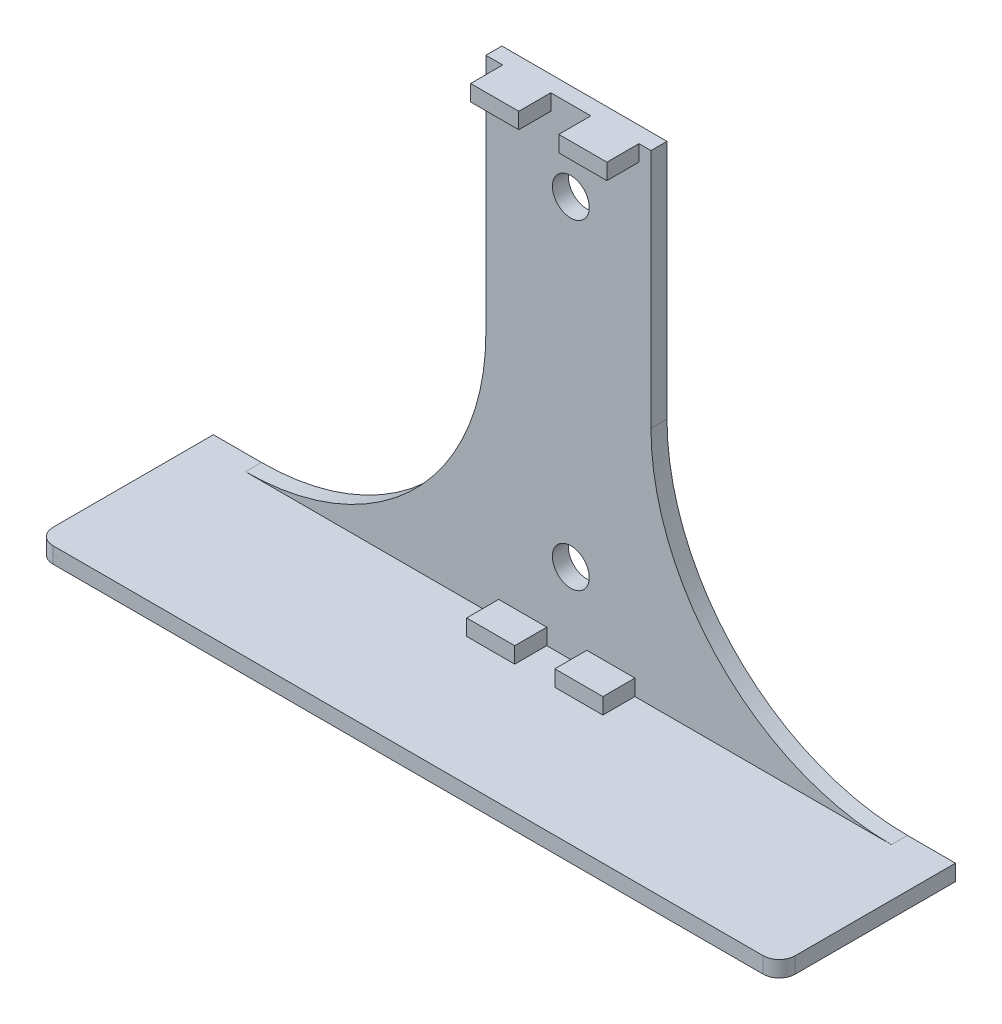
ISO-10303-21;
HEADER;
FILE_DESCRIPTION(('STEP AP214'),'2;1');
FILE_NAME('part.step','',(''),(''),'','','');
FILE_SCHEMA(('AUTOMOTIVE_DESIGN { 1 0 10303 214 1 1 1 1 }'));
ENDSEC;
DATA;
#1=APPLICATION_CONTEXT('core data for automotive mechanical design processes');
#2=APPLICATION_PROTOCOL_DEFINITION('international standard','automotive_design',2000,#1);
#3=PRODUCT_CONTEXT('',#1,'mechanical');
#4=PRODUCT('Part','Part','',(#3));
#5=PRODUCT_RELATED_PRODUCT_CATEGORY('part','',(#4));
#6=PRODUCT_DEFINITION_FORMATION('','',#4);
#7=PRODUCT_DEFINITION_CONTEXT('part definition',#1,'design');
#8=PRODUCT_DEFINITION('design','',#6,#7);
#9=PRODUCT_DEFINITION_SHAPE('','',#8);
#10=(LENGTH_UNIT() NAMED_UNIT(*) SI_UNIT(.MILLI.,.METRE.));
#11=(NAMED_UNIT(*) PLANE_ANGLE_UNIT() SI_UNIT($,.RADIAN.));
#12=(NAMED_UNIT(*) SI_UNIT($,.STERADIAN.) SOLID_ANGLE_UNIT());
#13=UNCERTAINTY_MEASURE_WITH_UNIT(LENGTH_MEASURE(1.E-05),#10,'distance_accuracy_value','');
#14=(GEOMETRIC_REPRESENTATION_CONTEXT(3) GLOBAL_UNCERTAINTY_ASSIGNED_CONTEXT((#13)) GLOBAL_UNIT_ASSIGNED_CONTEXT((#10,
#11,#12)) REPRESENTATION_CONTEXT('',''));
#15=CARTESIAN_POINT('',(0.,0.,0.));
#16=DIRECTION('',(0.,0.,1.));
#17=DIRECTION('',(1.,0.,0.));
#18=AXIS2_PLACEMENT_3D('',#15,#16,#17);
#19=CARTESIAN_POINT('',(0.,2.,0.));
#20=DIRECTION('',(0.,1.,0.));
#21=DIRECTION('',(0.,0.,1.));
#22=AXIS2_PLACEMENT_3D('',#19,#20,#21);
#23=PLANE('',#22);
#24=DIRECTION('',(-1.,0.,0.));
#25=VECTOR('',#24,1.);
#26=CARTESIAN_POINT('',(-192.646488806007,2.,-84.5666189891139));
#27=LINE('',#26,#25);
#28=CARTESIAN_POINT('',(-100.046488806007,2.,-84.5666189891139));
#29=VERTEX_POINT('',#28);
#30=CARTESIAN_POINT('',(-106.046488806007,2.,-84.5666189891139));
#31=VERTEX_POINT('',#30);
#32=EDGE_CURVE('E443',#29,#31,#27,.T.);
#33=ORIENTED_EDGE('',*,*,#32,.T.);
#34=DIRECTION('',(0.,0.,-1.));
#35=VECTOR('',#34,1.);
#36=CARTESIAN_POINT('',(-106.046488806007,2.,0.));
#37=LINE('',#36,#35);
#38=CARTESIAN_POINT('',(-106.046488806007,2.,-82.5666189891139));
#39=VERTEX_POINT('',#38);
#40=EDGE_CURVE('E508',#31,#39,#37,.F.);
#41=ORIENTED_EDGE('',*,*,#40,.T.);
#42=DIRECTION('',(1.,0.,0.));
#43=VECTOR('',#42,1.);
#44=CARTESIAN_POINT('',(-156.646488806007,2.,-82.5666189891139));
#45=LINE('',#44,#43);
#46=CARTESIAN_POINT('',(-138.046488806007,2.,-82.5666189891139));
#47=VERTEX_POINT('',#46);
#48=EDGE_CURVE('E401',#47,#39,#45,.T.);
#49=ORIENTED_EDGE('',*,*,#48,.F.);
#50=DIRECTION('',(0.,0.,-1.));
#51=VECTOR('',#50,1.);
#52=CARTESIAN_POINT('',(-138.046488806007,2.,-78.5666189891139));
#53=LINE('',#52,#51);
#54=CARTESIAN_POINT('',(-138.046488806007,2.,-78.5666189891139));
#55=VERTEX_POINT('',#54);
#56=EDGE_CURVE('E273',#55,#47,#53,.T.);
#57=ORIENTED_EDGE('',*,*,#56,.F.);
#58=DIRECTION('',(1.,0.,0.));
#59=VECTOR('',#58,1.);
#60=CARTESIAN_POINT('',(-144.046488806007,2.,-78.5666189891139));
#61=LINE('',#60,#59);
#62=CARTESIAN_POINT('',(-144.046488806007,2.,-78.5666189891139));
#63=VERTEX_POINT('',#62);
#64=EDGE_CURVE('E281',#63,#55,#61,.T.);
#65=ORIENTED_EDGE('',*,*,#64,.F.);
#66=DIRECTION('',(0.,0.,-1.));
#67=VECTOR('',#66,1.);
#68=CARTESIAN_POINT('',(-144.046488806007,2.,-78.5666189891139));
#69=LINE('',#68,#67);
#70=CARTESIAN_POINT('',(-144.046488806007,2.,-82.5666189891139));
#71=VERTEX_POINT('',#70);
#72=EDGE_CURVE('E622',#63,#71,#69,.T.);
#73=ORIENTED_EDGE('',*,*,#72,.T.);
#74=CARTESIAN_POINT('',(-149.046488806007,2.,-82.5666189891139));
#75=VERTEX_POINT('',#74);
#76=EDGE_CURVE('E243',#75,#71,#45,.T.);
#77=ORIENTED_EDGE('',*,*,#76,.F.);
#78=DIRECTION('',(0.,0.,-1.));
#79=VECTOR('',#78,1.);
#80=CARTESIAN_POINT('',(-149.046488806007,2.00000000000002,-78.5666189891139));
#81=LINE('',#80,#79);
#82=CARTESIAN_POINT('',(-149.046488806007,2.,-78.5666189891139));
#83=VERTEX_POINT('',#82);
#84=EDGE_CURVE('E328',#83,#75,#81,.T.);
#85=ORIENTED_EDGE('',*,*,#84,.F.);
#86=DIRECTION('',(1.,0.,0.));
#87=VECTOR('',#86,1.);
#88=CARTESIAN_POINT('',(-155.046488806007,2.00000000000002,-78.5666189891139));
#89=LINE('',#88,#87);
#90=CARTESIAN_POINT('',(-155.046488806007,2.,-78.5666189891139));
#91=VERTEX_POINT('',#90);
#92=EDGE_CURVE('E358',#91,#83,#89,.T.);
#93=ORIENTED_EDGE('',*,*,#92,.F.);
#94=DIRECTION('',(0.,0.,-1.));
#95=VECTOR('',#94,1.);
#96=CARTESIAN_POINT('',(-155.046488806007,2.00000000000002,-78.5666189891139));
#97=LINE('',#96,#95);
#98=CARTESIAN_POINT('',(-155.046488806007,2.,-82.5666189891139));
#99=VERTEX_POINT('',#98);
#100=EDGE_CURVE('E248',#91,#99,#97,.T.);
#101=ORIENTED_EDGE('',*,*,#100,.T.);
#102=CARTESIAN_POINT('',(-186.646488806007,2.,-82.5666189891139));
#103=VERTEX_POINT('',#102);
#104=EDGE_CURVE('E407',#103,#99,#45,.T.);
#105=ORIENTED_EDGE('',*,*,#104,.F.);
#106=DIRECTION('',(0.,0.,1.));
#107=VECTOR('',#106,1.);
#108=CARTESIAN_POINT('',(-186.646488806007,2.,0.));
#109=LINE('',#108,#107);
#110=CARTESIAN_POINT('',(-186.646488806007,2.,-84.5666189891139));
#111=VERTEX_POINT('',#110);
#112=EDGE_CURVE('E505',#103,#111,#109,.F.);
#113=ORIENTED_EDGE('',*,*,#112,.T.);
#114=CARTESIAN_POINT('',(-192.646488806007,2.,-84.5666189891139));
#115=VERTEX_POINT('',#114);
#116=EDGE_CURVE('E441',#111,#115,#27,.T.);
#117=ORIENTED_EDGE('',*,*,#116,.T.);
#118=DIRECTION('',(0.,0.,1.));
#119=VECTOR('',#118,1.);
#120=CARTESIAN_POINT('',(-192.646488806007,2.,-84.5666189891139));
#121=LINE('',#120,#119);
#122=CARTESIAN_POINT('',(-192.646488806007,2.,-64.5666189891139));
#123=VERTEX_POINT('',#122);
#124=EDGE_CURVE('E447',#115,#123,#121,.T.);
#125=ORIENTED_EDGE('',*,*,#124,.T.);
#126=CARTESIAN_POINT('',(-190.646488806007,2.,-64.5666189891139));
#127=DIRECTION('',(0.,1.,0.));
#128=DIRECTION('',(0.,0.,1.));
#129=AXIS2_PLACEMENT_3D('',#126,#127,#128);
#130=CIRCLE('',#129,2.);
#131=CARTESIAN_POINT('',(-190.646488806007,2.,-62.5666189891139));
#132=VERTEX_POINT('',#131);
#133=EDGE_CURVE('E492',#123,#132,#130,.T.);
#134=ORIENTED_EDGE('',*,*,#133,.T.);
#135=DIRECTION('',(1.,0.,0.));
#136=VECTOR('',#135,1.);
#137=CARTESIAN_POINT('',(-192.646488806007,2.,-62.5666189891139));
#138=LINE('',#137,#136);
#139=CARTESIAN_POINT('',(-102.046488806007,2.,-62.5666189891139));
#140=VERTEX_POINT('',#139);
#141=EDGE_CURVE('E451',#132,#140,#138,.T.);
#142=ORIENTED_EDGE('',*,*,#141,.T.);
#143=CARTESIAN_POINT('',(-102.046488806007,2.,-64.5666189891139));
#144=DIRECTION('',(0.,1.,0.));
#145=DIRECTION('',(0.,0.,1.));
#146=AXIS2_PLACEMENT_3D('',#143,#144,#145);
#147=CIRCLE('',#146,2.);
#148=CARTESIAN_POINT('',(-100.046488806007,2.,-64.5666189891139));
#149=VERTEX_POINT('',#148);
#150=EDGE_CURVE('E495',#140,#149,#147,.T.);
#151=ORIENTED_EDGE('',*,*,#150,.T.);
#152=DIRECTION('',(0.,0.,-1.));
#153=VECTOR('',#152,1.);
#154=CARTESIAN_POINT('',(-100.046488806007,2.,-84.5666189891139));
#155=LINE('',#154,#153);
#156=EDGE_CURVE('E438',#149,#29,#155,.T.);
#157=ORIENTED_EDGE('',*,*,#156,.T.);
#158=EDGE_LOOP('',(#33,#41,#49,#57,#65,#73,#77,#85,#93,#101,#105,#113,#117,#125,#134,#142,#151,#157));
#159=FACE_BOUND('',#158,.T.);
#160=ADVANCED_FACE('F49',(#159),#23,.T.);
#161=CARTESIAN_POINT('',(-156.646488806007,62.,-82.5666189891139));
#162=DIRECTION('',(0.,0.,-1.));
#163=DIRECTION('',(-1.,0.,0.));
#164=AXIS2_PLACEMENT_3D('',#161,#162,#163);
#165=PLANE('',#164);
#166=CARTESIAN_POINT('',(-146.046488806007,52.,-82.5666189891139));
#167=DIRECTION('',(0.,0.,1.));
#168=DIRECTION('',(1.,0.,0.));
#169=AXIS2_PLACEMENT_3D('',#166,#167,#168);
#170=CIRCLE('',#169,2.30000000000001);
#171=CARTESIAN_POINT('',(-143.746488806007,52.,-82.5666189891139));
#172=VERTEX_POINT('',#171);
#173=EDGE_CURVE('E623',#172,#172,#170,.T.);
#174=ORIENTED_EDGE('',*,*,#173,.F.);
#175=EDGE_LOOP('',(#174));
#176=FACE_BOUND('',#175,.T.);
#177=CARTESIAN_POINT('',(-146.046488806007,12.,-82.5666189891139));
#178=DIRECTION('',(0.,0.,1.));
#179=DIRECTION('',(1.,0.,0.));
#180=AXIS2_PLACEMENT_3D('',#177,#178,#179);
#181=CIRCLE('',#180,2.30000000000001);
#182=CARTESIAN_POINT('',(-143.746488806007,12.,-82.5666189891139));
#183=VERTEX_POINT('',#182);
#184=EDGE_CURVE('E630',#183,#183,#181,.T.);
#185=ORIENTED_EDGE('',*,*,#184,.F.);
#186=EDGE_LOOP('',(#185));
#187=FACE_BOUND('',#186,.T.);
#188=DIRECTION('',(0.,-1.,0.));
#189=VECTOR('',#188,1.);
#190=CARTESIAN_POINT('',(-143.546488806007,62.,-82.5666189891139));
#191=LINE('',#190,#189);
#192=CARTESIAN_POINT('',(-143.546488806007,62.,-82.5666189891139));
#193=VERTEX_POINT('',#192);
#194=CARTESIAN_POINT('',(-143.546488806007,60.,-82.5666189891139));
#195=VERTEX_POINT('',#194);
#196=EDGE_CURVE('E310',#193,#195,#191,.T.);
#197=ORIENTED_EDGE('',*,*,#196,.F.);
#198=DIRECTION('',(1.,0.,0.));
#199=VECTOR('',#198,1.);
#200=CARTESIAN_POINT('',(-156.646488806007,62.,-82.5666189891139));
#201=LINE('',#200,#199);
#202=CARTESIAN_POINT('',(-148.546488806007,62.,-82.5666189891139));
#203=VERTEX_POINT('',#202);
#204=EDGE_CURVE('E413',#203,#193,#201,.T.);
#205=ORIENTED_EDGE('',*,*,#204,.F.);
#206=DIRECTION('',(0.,1.,0.));
#207=VECTOR('',#206,1.);
#208=CARTESIAN_POINT('',(-148.546488806007,62.,-82.5666189891139));
#209=LINE('',#208,#207);
#210=CARTESIAN_POINT('',(-148.546488806007,60.,-82.5666189891139));
#211=VERTEX_POINT('',#210);
#212=EDGE_CURVE('E370',#211,#203,#209,.T.);
#213=ORIENTED_EDGE('',*,*,#212,.F.);
#214=DIRECTION('',(1.,0.,0.));
#215=VECTOR('',#214,1.);
#216=CARTESIAN_POINT('',(-154.546488806007,60.,-82.5666189891139));
#217=LINE('',#216,#215);
#218=CARTESIAN_POINT('',(-154.546488806007,60.,-82.5666189891139));
#219=VERTEX_POINT('',#218);
#220=EDGE_CURVE('E383',#219,#211,#217,.T.);
#221=ORIENTED_EDGE('',*,*,#220,.F.);
#222=DIRECTION('',(0.,-1.,0.));
#223=VECTOR('',#222,1.);
#224=CARTESIAN_POINT('',(-154.546488806007,62.,-82.5666189891139));
#225=LINE('',#224,#223);
#226=CARTESIAN_POINT('',(-154.546488806007,62.,-82.5666189891139));
#227=VERTEX_POINT('',#226);
#228=EDGE_CURVE('E314',#227,#219,#225,.T.);
#229=ORIENTED_EDGE('',*,*,#228,.F.);
#230=CARTESIAN_POINT('',(-156.646488806007,62.,-82.5666189891139));
#231=VERTEX_POINT('',#230);
#232=EDGE_CURVE('E408',#231,#227,#201,.T.);
#233=ORIENTED_EDGE('',*,*,#232,.F.);
#234=DIRECTION('',(0.,-1.,0.));
#235=VECTOR('',#234,1.);
#236=CARTESIAN_POINT('',(-156.646488806007,62.,-82.5666189891139));
#237=LINE('',#236,#235);
#238=CARTESIAN_POINT('',(-156.646488806007,32.,-82.5666189891139));
#239=VERTEX_POINT('',#238);
#240=EDGE_CURVE('E433',#231,#239,#237,.T.);
#241=ORIENTED_EDGE('',*,*,#240,.T.);
#242=CARTESIAN_POINT('',(-186.646488806007,32.,-82.5666189891139));
#243=DIRECTION('',(0.,0.,-1.));
#244=DIRECTION('',(-1.,0.,0.));
#245=AXIS2_PLACEMENT_3D('',#242,#243,#244);
#246=CIRCLE('',#245,30.);
#247=EDGE_CURVE('E58',#239,#103,#246,.T.);
#248=ORIENTED_EDGE('',*,*,#247,.T.);
#249=ORIENTED_EDGE('',*,*,#104,.T.);
#250=DIRECTION('',(0.,-1.,0.));
#251=VECTOR('',#250,1.);
#252=CARTESIAN_POINT('',(-155.046488806007,4.00000000000002,-82.5666189891139));
#253=LINE('',#252,#251);
#254=CARTESIAN_POINT('',(-155.046488806007,4.00000000000002,-82.5666189891139));
#255=VERTEX_POINT('',#254);
#256=EDGE_CURVE('E291',#255,#99,#253,.T.);
#257=ORIENTED_EDGE('',*,*,#256,.F.);
#258=DIRECTION('',(-1.,0.,0.));
#259=VECTOR('',#258,1.);
#260=CARTESIAN_POINT('',(-155.046488806007,4.00000000000002,-82.5666189891139));
#261=LINE('',#260,#259);
#262=CARTESIAN_POINT('',(-149.046488806007,4.00000000000002,-82.5666189891139));
#263=VERTEX_POINT('',#262);
#264=EDGE_CURVE('E341',#263,#255,#261,.T.);
#265=ORIENTED_EDGE('',*,*,#264,.F.);
#266=DIRECTION('',(0.,1.,0.));
#267=VECTOR('',#266,1.);
#268=CARTESIAN_POINT('',(-149.046488806007,4.00000000000002,-82.5666189891139));
#269=LINE('',#268,#267);
#270=EDGE_CURVE('E345',#75,#263,#269,.T.);
#271=ORIENTED_EDGE('',*,*,#270,.F.);
#272=ORIENTED_EDGE('',*,*,#76,.T.);
#273=DIRECTION('',(0.,-1.,0.));
#274=VECTOR('',#273,1.);
#275=CARTESIAN_POINT('',(-144.046488806007,4.00000000000001,-82.5666189891139));
#276=LINE('',#275,#274);
#277=CARTESIAN_POINT('',(-144.046488806007,4.00000000000001,-82.5666189891139));
#278=VERTEX_POINT('',#277);
#279=EDGE_CURVE('E236',#278,#71,#276,.T.);
#280=ORIENTED_EDGE('',*,*,#279,.F.);
#281=DIRECTION('',(-1.,0.,0.));
#282=VECTOR('',#281,1.);
#283=CARTESIAN_POINT('',(-144.046488806007,4.00000000000001,-82.5666189891139));
#284=LINE('',#283,#282);
#285=CARTESIAN_POINT('',(-138.046488806007,4.00000000000002,-82.5666189891139));
#286=VERTEX_POINT('',#285);
#287=EDGE_CURVE('E240',#286,#278,#284,.T.);
#288=ORIENTED_EDGE('',*,*,#287,.F.);
#289=DIRECTION('',(0.,1.,0.));
#290=VECTOR('',#289,1.);
#291=CARTESIAN_POINT('',(-138.046488806007,4.00000000000002,-82.5666189891139));
#292=LINE('',#291,#290);
#293=EDGE_CURVE('E249',#47,#286,#292,.T.);
#294=ORIENTED_EDGE('',*,*,#293,.F.);
#295=ORIENTED_EDGE('',*,*,#48,.T.);
#296=CARTESIAN_POINT('',(-106.046488806007,32.,-82.5666189891139));
#297=DIRECTION('',(0.,0.,-1.));
#298=DIRECTION('',(-1.,0.,0.));
#299=AXIS2_PLACEMENT_3D('',#296,#297,#298);
#300=CIRCLE('',#299,30.);
#301=CARTESIAN_POINT('',(-136.046488806007,32.,-82.5666189891139));
#302=VERTEX_POINT('',#301);
#303=EDGE_CURVE('E518',#39,#302,#300,.T.);
#304=ORIENTED_EDGE('',*,*,#303,.T.);
#305=DIRECTION('',(0.,-1.,0.));
#306=VECTOR('',#305,1.);
#307=CARTESIAN_POINT('',(-136.046488806007,62.,-82.5666189891139));
#308=LINE('',#307,#306);
#309=CARTESIAN_POINT('',(-136.046488806007,62.,-82.5666189891139));
#310=VERTEX_POINT('',#309);
#311=EDGE_CURVE('E429',#310,#302,#308,.T.);
#312=ORIENTED_EDGE('',*,*,#311,.F.);
#313=CARTESIAN_POINT('',(-137.546488806007,62.,-82.5666189891139));
#314=VERTEX_POINT('',#313);
#315=EDGE_CURVE('E406',#314,#310,#201,.T.);
#316=ORIENTED_EDGE('',*,*,#315,.F.);
#317=DIRECTION('',(0.,1.,0.));
#318=VECTOR('',#317,1.);
#319=CARTESIAN_POINT('',(-137.546488806007,62.,-82.5666189891139));
#320=LINE('',#319,#318);
#321=CARTESIAN_POINT('',(-137.546488806007,60.,-82.5666189891139));
#322=VERTEX_POINT('',#321);
#323=EDGE_CURVE('E302',#322,#314,#320,.T.);
#324=ORIENTED_EDGE('',*,*,#323,.F.);
#325=DIRECTION('',(1.,0.,0.));
#326=VECTOR('',#325,1.);
#327=CARTESIAN_POINT('',(-143.546488806007,60.,-82.5666189891139));
#328=LINE('',#327,#326);
#329=EDGE_CURVE('E306',#195,#322,#328,.T.);
#330=ORIENTED_EDGE('',*,*,#329,.F.);
#331=EDGE_LOOP('',(#197,#205,#213,#221,#229,#233,#241,#248,#249,#257,#265,#271,#272,#280,#288,
#294,#295,#304,#312,#316,#324,#330));
#332=FACE_BOUND('',#331,.T.);
#333=ADVANCED_FACE('F239',(#176,#187,#332),#165,.F.);
#334=CARTESIAN_POINT('',(-100.046488806007,2.,-84.5666189891139));
#335=DIRECTION('',(-1.,0.,0.));
#336=DIRECTION('',(0.,0.,1.));
#337=AXIS2_PLACEMENT_3D('',#334,#335,#336);
#338=PLANE('',#337);
#339=ORIENTED_EDGE('',*,*,#156,.F.);
#340=DIRECTION('',(0.,-1.,0.));
#341=VECTOR('',#340,1.);
#342=CARTESIAN_POINT('',(-100.046488806007,2.,-64.5666189891139));
#343=LINE('',#342,#341);
#344=CARTESIAN_POINT('',(-100.046488806007,0.,-64.5666189891139));
#345=VERTEX_POINT('',#344);
#346=EDGE_CURVE('E475',#149,#345,#343,.T.);
#347=ORIENTED_EDGE('',*,*,#346,.T.);
#348=DIRECTION('',(0.,0.,-1.));
#349=VECTOR('',#348,1.);
#350=CARTESIAN_POINT('',(-100.046488806007,0.,-84.5666189891139));
#351=LINE('',#350,#349);
#352=CARTESIAN_POINT('',(-100.046488806007,0.,-84.5666189891139));
#353=VERTEX_POINT('',#352);
#354=EDGE_CURVE('E437',#345,#353,#351,.T.);
#355=ORIENTED_EDGE('',*,*,#354,.T.);
#356=DIRECTION('',(0.,-1.,0.));
#357=VECTOR('',#356,1.);
#358=CARTESIAN_POINT('',(-100.046488806007,2.,-84.5666189891139));
#359=LINE('',#358,#357);
#360=EDGE_CURVE('E471',#29,#353,#359,.T.);
#361=ORIENTED_EDGE('',*,*,#360,.F.);
#362=EDGE_LOOP('',(#339,#347,#355,#361));
#363=FACE_BOUND('',#362,.T.);
#364=ADVANCED_FACE('F674',(#363),#338,.F.);
#365=CARTESIAN_POINT('',(-192.646488806007,2.,-84.5666189891139));
#366=DIRECTION('',(0.,0.,1.));
#367=DIRECTION('',(1.,0.,0.));
#368=AXIS2_PLACEMENT_3D('',#365,#366,#367);
#369=PLANE('',#368);
#370=CARTESIAN_POINT('',(-146.046488806007,52.,-84.5666189891139));
#371=DIRECTION('',(0.,0.,1.));
#372=DIRECTION('',(1.,0.,0.));
#373=AXIS2_PLACEMENT_3D('',#370,#371,#372);
#374=CIRCLE('',#373,2.30000000000001);
#375=CARTESIAN_POINT('',(-143.746488806007,52.,-84.5666189891139));
#376=VERTEX_POINT('',#375);
#377=EDGE_CURVE('E619',#376,#376,#374,.F.);
#378=ORIENTED_EDGE('',*,*,#377,.F.);
#379=EDGE_LOOP('',(#378));
#380=FACE_BOUND('',#379,.T.);
#381=CARTESIAN_POINT('',(-146.046488806007,12.,-84.5666189891139));
#382=DIRECTION('',(0.,0.,1.));
#383=DIRECTION('',(1.,0.,0.));
#384=AXIS2_PLACEMENT_3D('',#381,#382,#383);
#385=CIRCLE('',#384,2.30000000000001);
#386=CARTESIAN_POINT('',(-143.746488806007,12.,-84.5666189891139));
#387=VERTEX_POINT('',#386);
#388=EDGE_CURVE('E634',#387,#387,#385,.F.);
#389=ORIENTED_EDGE('',*,*,#388,.F.);
#390=EDGE_LOOP('',(#389));
#391=FACE_BOUND('',#390,.T.);
#392=DIRECTION('',(-1.,0.,0.));
#393=VECTOR('',#392,1.);
#394=CARTESIAN_POINT('',(-192.646488806007,0.,-84.5666189891139));
#395=LINE('',#394,#393);
#396=CARTESIAN_POINT('',(-192.646488806007,0.,-84.5666189891139));
#397=VERTEX_POINT('',#396);
#398=EDGE_CURVE('E458',#353,#397,#395,.T.);
#399=ORIENTED_EDGE('',*,*,#398,.T.);
#400=DIRECTION('',(0.,-1.,0.));
#401=VECTOR('',#400,1.);
#402=CARTESIAN_POINT('',(-192.646488806007,2.,-84.5666189891139));
#403=LINE('',#402,#401);
#404=EDGE_CURVE('E455',#115,#397,#403,.T.);
#405=ORIENTED_EDGE('',*,*,#404,.F.);
#406=ORIENTED_EDGE('',*,*,#116,.F.);
#407=CARTESIAN_POINT('',(-186.646488806007,32.,-84.5666189891139));
#408=DIRECTION('',(0.,0.,1.));
#409=DIRECTION('',(1.,0.,0.));
#410=AXIS2_PLACEMENT_3D('',#407,#408,#409);
#411=CIRCLE('',#410,30.);
#412=CARTESIAN_POINT('',(-156.646488806007,32.,-84.5666189891139));
#413=VERTEX_POINT('',#412);
#414=EDGE_CURVE('E11',#111,#413,#411,.T.);
#415=ORIENTED_EDGE('',*,*,#414,.T.);
#416=DIRECTION('',(0.,-1.,0.));
#417=VECTOR('',#416,1.);
#418=CARTESIAN_POINT('',(-156.646488806007,62.,-84.5666189891139));
#419=LINE('',#418,#417);
#420=CARTESIAN_POINT('',(-156.646488806007,62.,-84.5666189891139));
#421=VERTEX_POINT('',#420);
#422=EDGE_CURVE('E419',#421,#413,#419,.T.);
#423=ORIENTED_EDGE('',*,*,#422,.F.);
#424=DIRECTION('',(-1.,0.,0.));
#425=VECTOR('',#424,1.);
#426=CARTESIAN_POINT('',(-156.646488806007,62.,-84.5666189891139));
#427=LINE('',#426,#425);
#428=CARTESIAN_POINT('',(-136.046488806007,62.,-84.5666189891139));
#429=VERTEX_POINT('',#428);
#430=EDGE_CURVE('E416',#429,#421,#427,.T.);
#431=ORIENTED_EDGE('',*,*,#430,.F.);
#432=DIRECTION('',(0.,-1.,0.));
#433=VECTOR('',#432,1.);
#434=CARTESIAN_POINT('',(-136.046488806007,62.,-84.5666189891139));
#435=LINE('',#434,#433);
#436=CARTESIAN_POINT('',(-136.046488806007,32.,-84.5666189891139));
#437=VERTEX_POINT('',#436);
#438=EDGE_CURVE('E425',#429,#437,#435,.T.);
#439=ORIENTED_EDGE('',*,*,#438,.T.);
#440=CARTESIAN_POINT('',(-106.046488806007,32.,-84.5666189891139));
#441=DIRECTION('',(0.,0.,1.));
#442=DIRECTION('',(1.,0.,0.));
#443=AXIS2_PLACEMENT_3D('',#440,#441,#442);
#444=CIRCLE('',#443,30.);
#445=EDGE_CURVE('E515',#437,#31,#444,.T.);
#446=ORIENTED_EDGE('',*,*,#445,.T.);
#447=ORIENTED_EDGE('',*,*,#32,.F.);
#448=ORIENTED_EDGE('',*,*,#360,.T.);
#449=EDGE_LOOP('',(#399,#405,#406,#415,#423,#431,#439,#446,#447,#448));
#450=FACE_BOUND('',#449,.T.);
#451=ADVANCED_FACE('F525',(#380,#391,#450),#369,.F.);
#452=CARTESIAN_POINT('',(-192.646488806007,2.,-84.5666189891139));
#453=DIRECTION('',(1.,0.,0.));
#454=DIRECTION('',(0.,0.,-1.));
#455=AXIS2_PLACEMENT_3D('',#452,#453,#454);
#456=PLANE('',#455);
#457=DIRECTION('',(0.,0.,1.));
#458=VECTOR('',#457,1.);
#459=CARTESIAN_POINT('',(-192.646488806007,0.,-84.5666189891139));
#460=LINE('',#459,#458);
#461=CARTESIAN_POINT('',(-192.646488806007,0.,-64.5666189891139));
#462=VERTEX_POINT('',#461);
#463=EDGE_CURVE('E461',#397,#462,#460,.T.);
#464=ORIENTED_EDGE('',*,*,#463,.T.);
#465=DIRECTION('',(0.,-1.,0.));
#466=VECTOR('',#465,1.);
#467=CARTESIAN_POINT('',(-192.646488806007,2.,-64.5666189891139));
#468=LINE('',#467,#466);
#469=EDGE_CURVE('E498',#462,#123,#468,.F.);
#470=ORIENTED_EDGE('',*,*,#469,.T.);
#471=ORIENTED_EDGE('',*,*,#124,.F.);
#472=ORIENTED_EDGE('',*,*,#404,.T.);
#473=EDGE_LOOP('',(#464,#470,#471,#472));
#474=FACE_BOUND('',#473,.T.);
#475=ADVANCED_FACE('F688',(#474),#456,.F.);
#476=CARTESIAN_POINT('',(-192.646488806007,2.,-62.5666189891139));
#477=DIRECTION('',(0.,0.,-1.));
#478=DIRECTION('',(-1.,0.,0.));
#479=AXIS2_PLACEMENT_3D('',#476,#477,#478);
#480=PLANE('',#479);
#481=DIRECTION('',(1.,0.,0.));
#482=VECTOR('',#481,1.);
#483=CARTESIAN_POINT('',(-192.646488806007,0.,-62.5666189891139));
#484=LINE('',#483,#482);
#485=CARTESIAN_POINT('',(-190.646488806007,0.,-62.5666189891139));
#486=VERTEX_POINT('',#485);
#487=CARTESIAN_POINT('',(-102.046488806007,0.,-62.5666189891139));
#488=VERTEX_POINT('',#487);
#489=EDGE_CURVE('E442',#486,#488,#484,.T.);
#490=ORIENTED_EDGE('',*,*,#489,.T.);
#491=DIRECTION('',(0.,-1.,0.));
#492=VECTOR('',#491,1.);
#493=CARTESIAN_POINT('',(-102.046488806007,2.,-62.5666189891139));
#494=LINE('',#493,#492);
#495=EDGE_CURVE('E489',#488,#140,#494,.F.);
#496=ORIENTED_EDGE('',*,*,#495,.T.);
#497=ORIENTED_EDGE('',*,*,#141,.F.);
#498=DIRECTION('',(0.,-1.,0.));
#499=VECTOR('',#498,1.);
#500=CARTESIAN_POINT('',(-190.646488806007,2.,-62.5666189891139));
#501=LINE('',#500,#499);
#502=EDGE_CURVE('E485',#132,#486,#501,.T.);
#503=ORIENTED_EDGE('',*,*,#502,.T.);
#504=EDGE_LOOP('',(#490,#496,#497,#503));
#505=FACE_BOUND('',#504,.T.);
#506=ADVANCED_FACE('F684',(#505),#480,.F.);
#507=CARTESIAN_POINT('',(0.,0.,0.));
#508=DIRECTION('',(0.,1.,0.));
#509=DIRECTION('',(0.,0.,1.));
#510=AXIS2_PLACEMENT_3D('',#507,#508,#509);
#511=PLANE('',#510);
#512=ORIENTED_EDGE('',*,*,#354,.F.);
#513=CARTESIAN_POINT('',(-102.046488806007,0.,-64.5666189891139));
#514=DIRECTION('',(0.,1.,0.));
#515=DIRECTION('',(0.,0.,1.));
#516=AXIS2_PLACEMENT_3D('',#513,#514,#515);
#517=CIRCLE('',#516,2.);
#518=EDGE_CURVE('E482',#345,#488,#517,.F.);
#519=ORIENTED_EDGE('',*,*,#518,.T.);
#520=ORIENTED_EDGE('',*,*,#489,.F.);
#521=CARTESIAN_POINT('',(-190.646488806007,0.,-64.5666189891139));
#522=DIRECTION('',(0.,1.,0.));
#523=DIRECTION('',(0.,0.,1.));
#524=AXIS2_PLACEMENT_3D('',#521,#522,#523);
#525=CIRCLE('',#524,2.);
#526=EDGE_CURVE('E479',#486,#462,#525,.F.);
#527=ORIENTED_EDGE('',*,*,#526,.T.);
#528=ORIENTED_EDGE('',*,*,#463,.F.);
#529=ORIENTED_EDGE('',*,*,#398,.F.);
#530=EDGE_LOOP('',(#512,#519,#520,#527,#528,#529));
#531=FACE_BOUND('',#530,.T.);
#532=ADVANCED_FACE('F680',(#531),#511,.F.);
#533=CARTESIAN_POINT('',(-102.046488806007,2.,-64.5666189891139));
#534=DIRECTION('',(0.,-1.,0.));
#535=DIRECTION('',(0.,0.,-1.));
#536=AXIS2_PLACEMENT_3D('',#533,#534,#535);
#537=CYLINDRICAL_SURFACE('',#536,2.);
#538=ORIENTED_EDGE('',*,*,#150,.F.);
#539=ORIENTED_EDGE('',*,*,#495,.F.);
#540=ORIENTED_EDGE('',*,*,#518,.F.);
#541=ORIENTED_EDGE('',*,*,#346,.F.);
#542=EDGE_LOOP('',(#538,#539,#540,#541));
#543=FACE_BOUND('',#542,.T.);
#544=ADVANCED_FACE('F683',(#543),#537,.T.);
#545=CARTESIAN_POINT('',(-190.646488806007,2.,-64.5666189891139));
#546=DIRECTION('',(0.,-1.,0.));
#547=DIRECTION('',(0.,0.,-1.));
#548=AXIS2_PLACEMENT_3D('',#545,#546,#547);
#549=CYLINDRICAL_SURFACE('',#548,2.);
#550=ORIENTED_EDGE('',*,*,#133,.F.);
#551=ORIENTED_EDGE('',*,*,#469,.F.);
#552=ORIENTED_EDGE('',*,*,#526,.F.);
#553=ORIENTED_EDGE('',*,*,#502,.F.);
#554=EDGE_LOOP('',(#550,#551,#552,#553));
#555=FACE_BOUND('',#554,.T.);
#556=ADVANCED_FACE('F701',(#555),#549,.T.);
#557=CARTESIAN_POINT('',(-156.646488806007,62.,-84.5666189891139));
#558=DIRECTION('',(1.,0.,0.));
#559=DIRECTION('',(0.,0.,-1.));
#560=AXIS2_PLACEMENT_3D('',#557,#558,#559);
#561=PLANE('',#560);
#562=ORIENTED_EDGE('',*,*,#422,.T.);
#563=DIRECTION('',(0.,0.,1.));
#564=VECTOR('',#563,1.);
#565=CARTESIAN_POINT('',(-156.646488806007,32.,-84.5666189891139));
#566=LINE('',#565,#564);
#567=EDGE_CURVE('E512',#413,#239,#566,.T.);
#568=ORIENTED_EDGE('',*,*,#567,.T.);
#569=ORIENTED_EDGE('',*,*,#240,.F.);
#570=DIRECTION('',(0.,0.,1.));
#571=VECTOR('',#570,1.);
#572=CARTESIAN_POINT('',(-156.646488806007,62.,-84.5666189891139));
#573=LINE('',#572,#571);
#574=EDGE_CURVE('E402',#421,#231,#573,.T.);
#575=ORIENTED_EDGE('',*,*,#574,.F.);
#576=EDGE_LOOP('',(#562,#568,#569,#575));
#577=FACE_BOUND('',#576,.T.);
#578=ADVANCED_FACE('F679',(#577),#561,.F.);
#579=CARTESIAN_POINT('',(-136.046488806007,62.,-84.5666189891139));
#580=DIRECTION('',(-1.,0.,0.));
#581=DIRECTION('',(0.,0.,1.));
#582=AXIS2_PLACEMENT_3D('',#579,#580,#581);
#583=PLANE('',#582);
#584=ORIENTED_EDGE('',*,*,#311,.T.);
#585=DIRECTION('',(0.,0.,-1.));
#586=VECTOR('',#585,1.);
#587=CARTESIAN_POINT('',(-136.046488806007,32.,-84.5666189891139));
#588=LINE('',#587,#586);
#589=EDGE_CURVE('E501',#302,#437,#588,.T.);
#590=ORIENTED_EDGE('',*,*,#589,.T.);
#591=ORIENTED_EDGE('',*,*,#438,.F.);
#592=DIRECTION('',(0.,0.,-1.));
#593=VECTOR('',#592,1.);
#594=CARTESIAN_POINT('',(-136.046488806007,62.,-84.5666189891139));
#595=LINE('',#594,#593);
#596=EDGE_CURVE('E412',#310,#429,#595,.T.);
#597=ORIENTED_EDGE('',*,*,#596,.F.);
#598=EDGE_LOOP('',(#584,#590,#591,#597));
#599=FACE_BOUND('',#598,.T.);
#600=ADVANCED_FACE('F721',(#599),#583,.F.);
#601=CARTESIAN_POINT('',(0.,62.,0.));
#602=DIRECTION('',(0.,1.,0.));
#603=DIRECTION('',(0.,0.,1.));
#604=AXIS2_PLACEMENT_3D('',#601,#602,#603);
#605=PLANE('',#604);
#606=ORIENTED_EDGE('',*,*,#574,.T.);
#607=ORIENTED_EDGE('',*,*,#232,.T.);
#608=DIRECTION('',(0.,0.,-1.));
#609=VECTOR('',#608,1.);
#610=CARTESIAN_POINT('',(-154.546488806007,62.,-78.5666189891139));
#611=LINE('',#610,#609);
#612=CARTESIAN_POINT('',(-154.546488806007,62.,-78.5666189891139));
#613=VERTEX_POINT('',#612);
#614=EDGE_CURVE('E379',#613,#227,#611,.T.);
#615=ORIENTED_EDGE('',*,*,#614,.F.);
#616=DIRECTION('',(-1.,0.,0.));
#617=VECTOR('',#616,1.);
#618=CARTESIAN_POINT('',(-154.546488806007,62.,-78.5666189891139));
#619=LINE('',#618,#617);
#620=CARTESIAN_POINT('',(-148.546488806007,62.,-78.5666189891139));
#621=VERTEX_POINT('',#620);
#622=EDGE_CURVE('E376',#621,#613,#619,.T.);
#623=ORIENTED_EDGE('',*,*,#622,.F.);
#624=DIRECTION('',(0.,0.,-1.));
#625=VECTOR('',#624,1.);
#626=CARTESIAN_POINT('',(-148.546488806007,62.,-78.5666189891139));
#627=LINE('',#626,#625);
#628=EDGE_CURVE('E391',#621,#203,#627,.T.);
#629=ORIENTED_EDGE('',*,*,#628,.T.);
#630=ORIENTED_EDGE('',*,*,#204,.T.);
#631=DIRECTION('',(0.,0.,-1.));
#632=VECTOR('',#631,1.);
#633=CARTESIAN_POINT('',(-143.546488806007,62.,-78.5666189891139));
#634=LINE('',#633,#632);
#635=CARTESIAN_POINT('',(-143.546488806007,62.,-78.5666189891139));
#636=VERTEX_POINT('',#635);
#637=EDGE_CURVE('E298',#636,#193,#634,.T.);
#638=ORIENTED_EDGE('',*,*,#637,.F.);
#639=DIRECTION('',(-1.,0.,0.));
#640=VECTOR('',#639,1.);
#641=CARTESIAN_POINT('',(-143.546488806007,62.,-78.5666189891139));
#642=LINE('',#641,#640);
#643=CARTESIAN_POINT('',(-137.546488806007,62.,-78.5666189891139));
#644=VERTEX_POINT('',#643);
#645=EDGE_CURVE('E301',#644,#636,#642,.T.);
#646=ORIENTED_EDGE('',*,*,#645,.F.);
#647=DIRECTION('',(0.,0.,-1.));
#648=VECTOR('',#647,1.);
#649=CARTESIAN_POINT('',(-137.546488806007,62.,-78.5666189891139));
#650=LINE('',#649,#648);
#651=EDGE_CURVE('E295',#644,#314,#650,.T.);
#652=ORIENTED_EDGE('',*,*,#651,.T.);
#653=ORIENTED_EDGE('',*,*,#315,.T.);
#654=ORIENTED_EDGE('',*,*,#596,.T.);
#655=ORIENTED_EDGE('',*,*,#430,.T.);
#656=EDGE_LOOP('',(#606,#607,#615,#623,#629,#630,#638,#646,#652,#653,#654,#655));
#657=FACE_BOUND('',#656,.T.);
#658=ADVANCED_FACE('F725',(#657),#605,.T.);
#659=CARTESIAN_POINT('',(-154.546488806007,62.,-78.5666189891139));
#660=DIRECTION('',(1.,0.,0.));
#661=DIRECTION('',(0.,0.,-1.));
#662=AXIS2_PLACEMENT_3D('',#659,#660,#661);
#663=PLANE('',#662);
#664=ORIENTED_EDGE('',*,*,#228,.T.);
#665=DIRECTION('',(0.,0.,-1.));
#666=VECTOR('',#665,1.);
#667=CARTESIAN_POINT('',(-154.546488806007,60.,-78.5666189891139));
#668=LINE('',#667,#666);
#669=CARTESIAN_POINT('',(-154.546488806007,60.,-78.5666189891139));
#670=VERTEX_POINT('',#669);
#671=EDGE_CURVE('E398',#670,#219,#668,.T.);
#672=ORIENTED_EDGE('',*,*,#671,.F.);
#673=DIRECTION('',(0.,-1.,0.));
#674=VECTOR('',#673,1.);
#675=CARTESIAN_POINT('',(-154.546488806007,62.,-78.5666189891139));
#676=LINE('',#675,#674);
#677=EDGE_CURVE('E365',#613,#670,#676,.T.);
#678=ORIENTED_EDGE('',*,*,#677,.F.);
#679=ORIENTED_EDGE('',*,*,#614,.T.);
#680=EDGE_LOOP('',(#664,#672,#678,#679));
#681=FACE_BOUND('',#680,.T.);
#682=ADVANCED_FACE('F757',(#681),#663,.F.);
#683=CARTESIAN_POINT('',(-154.546488806007,60.,-78.5666189891139));
#684=DIRECTION('',(0.,1.,0.));
#685=DIRECTION('',(-1.,0.,0.));
#686=AXIS2_PLACEMENT_3D('',#683,#684,#685);
#687=PLANE('',#686);
#688=ORIENTED_EDGE('',*,*,#220,.T.);
#689=DIRECTION('',(0.,0.,-1.));
#690=VECTOR('',#689,1.);
#691=CARTESIAN_POINT('',(-148.546488806007,60.,-78.5666189891139));
#692=LINE('',#691,#690);
#693=CARTESIAN_POINT('',(-148.546488806007,60.,-78.5666189891139));
#694=VERTEX_POINT('',#693);
#695=EDGE_CURVE('E394',#694,#211,#692,.T.);
#696=ORIENTED_EDGE('',*,*,#695,.F.);
#697=DIRECTION('',(1.,0.,0.));
#698=VECTOR('',#697,1.);
#699=CARTESIAN_POINT('',(-154.546488806007,60.,-78.5666189891139));
#700=LINE('',#699,#698);
#701=EDGE_CURVE('E369',#670,#694,#700,.T.);
#702=ORIENTED_EDGE('',*,*,#701,.F.);
#703=ORIENTED_EDGE('',*,*,#671,.T.);
#704=EDGE_LOOP('',(#688,#696,#702,#703));
#705=FACE_BOUND('',#704,.T.);
#706=ADVANCED_FACE('F753',(#705),#687,.F.);
#707=CARTESIAN_POINT('',(-148.546488806007,62.,-78.5666189891139));
#708=DIRECTION('',(-1.,0.,0.));
#709=DIRECTION('',(0.,0.,1.));
#710=AXIS2_PLACEMENT_3D('',#707,#708,#709);
#711=PLANE('',#710);
#712=ORIENTED_EDGE('',*,*,#212,.T.);
#713=ORIENTED_EDGE('',*,*,#628,.F.);
#714=DIRECTION('',(0.,1.,0.));
#715=VECTOR('',#714,1.);
#716=CARTESIAN_POINT('',(-148.546488806007,62.,-78.5666189891139));
#717=LINE('',#716,#715);
#718=EDGE_CURVE('E373',#694,#621,#717,.T.);
#719=ORIENTED_EDGE('',*,*,#718,.F.);
#720=ORIENTED_EDGE('',*,*,#695,.T.);
#721=EDGE_LOOP('',(#712,#713,#719,#720));
#722=FACE_BOUND('',#721,.T.);
#723=ADVANCED_FACE('F748',(#722),#711,.F.);
#724=CARTESIAN_POINT('',(0.,0.,-78.5666189891139));
#725=DIRECTION('',(0.,0.,1.));
#726=DIRECTION('',(1.,0.,0.));
#727=AXIS2_PLACEMENT_3D('',#724,#725,#726);
#728=PLANE('',#727);
#729=ORIENTED_EDGE('',*,*,#677,.T.);
#730=ORIENTED_EDGE('',*,*,#701,.T.);
#731=ORIENTED_EDGE('',*,*,#718,.T.);
#732=ORIENTED_EDGE('',*,*,#622,.T.);
#733=EDGE_LOOP('',(#729,#730,#731,#732));
#734=FACE_BOUND('',#733,.T.);
#735=ADVANCED_FACE('F788',(#734),#728,.T.);
#736=CARTESIAN_POINT('',(-143.546488806007,62.,-78.5666189891139));
#737=DIRECTION('',(1.,0.,0.));
#738=DIRECTION('',(0.,0.,-1.));
#739=AXIS2_PLACEMENT_3D('',#736,#737,#738);
#740=PLANE('',#739);
#741=ORIENTED_EDGE('',*,*,#196,.T.);
#742=DIRECTION('',(0.,0.,-1.));
#743=VECTOR('',#742,1.);
#744=CARTESIAN_POINT('',(-143.546488806007,60.,-78.5666189891139));
#745=LINE('',#744,#743);
#746=CARTESIAN_POINT('',(-143.546488806007,60.,-78.5666189891139));
#747=VERTEX_POINT('',#746);
#748=EDGE_CURVE('E287',#747,#195,#745,.T.);
#749=ORIENTED_EDGE('',*,*,#748,.F.);
#750=DIRECTION('',(0.,-1.,0.));
#751=VECTOR('',#750,1.);
#752=CARTESIAN_POINT('',(-143.546488806007,62.,-78.5666189891139));
#753=LINE('',#752,#751);
#754=EDGE_CURVE('E307',#636,#747,#753,.T.);
#755=ORIENTED_EDGE('',*,*,#754,.F.);
#756=ORIENTED_EDGE('',*,*,#637,.T.);
#757=EDGE_LOOP('',(#741,#749,#755,#756));
#758=FACE_BOUND('',#757,.T.);
#759=ADVANCED_FACE('F739',(#758),#740,.F.);
#760=CARTESIAN_POINT('',(-143.546488806007,60.,-78.5666189891139));
#761=DIRECTION('',(0.,1.,0.));
#762=DIRECTION('',(-1.,0.,0.));
#763=AXIS2_PLACEMENT_3D('',#760,#761,#762);
#764=PLANE('',#763);
#765=ORIENTED_EDGE('',*,*,#329,.T.);
#766=DIRECTION('',(0.,0.,-1.));
#767=VECTOR('',#766,1.);
#768=CARTESIAN_POINT('',(-137.546488806007,60.,-78.5666189891139));
#769=LINE('',#768,#767);
#770=CARTESIAN_POINT('',(-137.546488806007,60.,-78.5666189891139));
#771=VERTEX_POINT('',#770);
#772=EDGE_CURVE('E290',#771,#322,#769,.T.);
#773=ORIENTED_EDGE('',*,*,#772,.F.);
#774=DIRECTION('',(1.,0.,0.));
#775=VECTOR('',#774,1.);
#776=CARTESIAN_POINT('',(-143.546488806007,60.,-78.5666189891139));
#777=LINE('',#776,#775);
#778=EDGE_CURVE('E320',#747,#771,#777,.T.);
#779=ORIENTED_EDGE('',*,*,#778,.F.);
#780=ORIENTED_EDGE('',*,*,#748,.T.);
#781=EDGE_LOOP('',(#765,#773,#779,#780));
#782=FACE_BOUND('',#781,.T.);
#783=ADVANCED_FACE('F735',(#782),#764,.F.);
#784=CARTESIAN_POINT('',(-137.546488806007,62.,-78.5666189891139));
#785=DIRECTION('',(-1.,0.,0.));
#786=DIRECTION('',(0.,0.,1.));
#787=AXIS2_PLACEMENT_3D('',#784,#785,#786);
#788=PLANE('',#787);
#789=ORIENTED_EDGE('',*,*,#323,.T.);
#790=ORIENTED_EDGE('',*,*,#651,.F.);
#791=DIRECTION('',(0.,1.,0.));
#792=VECTOR('',#791,1.);
#793=CARTESIAN_POINT('',(-137.546488806007,62.,-78.5666189891139));
#794=LINE('',#793,#792);
#795=EDGE_CURVE('E317',#771,#644,#794,.T.);
#796=ORIENTED_EDGE('',*,*,#795,.F.);
#797=ORIENTED_EDGE('',*,*,#772,.T.);
#798=EDGE_LOOP('',(#789,#790,#796,#797));
#799=FACE_BOUND('',#798,.T.);
#800=ADVANCED_FACE('F731',(#799),#788,.F.);
#801=CARTESIAN_POINT('',(0.,0.,-78.5666189891139));
#802=DIRECTION('',(0.,0.,1.));
#803=DIRECTION('',(1.,0.,0.));
#804=AXIS2_PLACEMENT_3D('',#801,#802,#803);
#805=PLANE('',#804);
#806=ORIENTED_EDGE('',*,*,#754,.T.);
#807=ORIENTED_EDGE('',*,*,#778,.T.);
#808=ORIENTED_EDGE('',*,*,#795,.T.);
#809=ORIENTED_EDGE('',*,*,#645,.T.);
#810=EDGE_LOOP('',(#806,#807,#808,#809));
#811=FACE_BOUND('',#810,.T.);
#812=ADVANCED_FACE('F802',(#811),#805,.T.);
#813=CARTESIAN_POINT('',(-144.046488806007,4.00000000000001,-78.5666189891139));
#814=DIRECTION('',(1.,0.,0.));
#815=DIRECTION('',(0.,0.,-1.));
#816=AXIS2_PLACEMENT_3D('',#813,#814,#815);
#817=PLANE('',#816);
#818=ORIENTED_EDGE('',*,*,#279,.T.);
#819=ORIENTED_EDGE('',*,*,#72,.F.);
#820=DIRECTION('',(0.,-1.,0.));
#821=VECTOR('',#820,1.);
#822=CARTESIAN_POINT('',(-144.046488806007,4.00000000000001,-78.5666189891139));
#823=LINE('',#822,#821);
#824=CARTESIAN_POINT('',(-144.046488806007,4.00000000000001,-78.5666189891139));
#825=VERTEX_POINT('',#824);
#826=EDGE_CURVE('E261',#825,#63,#823,.T.);
#827=ORIENTED_EDGE('',*,*,#826,.F.);
#828=DIRECTION('',(0.,0.,-1.));
#829=VECTOR('',#828,1.);
#830=CARTESIAN_POINT('',(-144.046488806007,4.00000000000001,-78.5666189891139));
#831=LINE('',#830,#829);
#832=EDGE_CURVE('E256',#825,#278,#831,.T.);
#833=ORIENTED_EDGE('',*,*,#832,.T.);
#834=EDGE_LOOP('',(#818,#819,#827,#833));
#835=FACE_BOUND('',#834,.T.);
#836=ADVANCED_FACE('F263',(#835),#817,.F.);
#837=CARTESIAN_POINT('',(-138.046488806007,4.00000000000002,-78.5666189891139));
#838=DIRECTION('',(-1.,0.,0.));
#839=DIRECTION('',(0.,0.,1.));
#840=AXIS2_PLACEMENT_3D('',#837,#838,#839);
#841=PLANE('',#840);
#842=ORIENTED_EDGE('',*,*,#293,.T.);
#843=DIRECTION('',(0.,0.,-1.));
#844=VECTOR('',#843,1.);
#845=CARTESIAN_POINT('',(-138.046488806007,4.00000000000002,-78.5666189891139));
#846=LINE('',#845,#844);
#847=CARTESIAN_POINT('',(-138.046488806007,4.00000000000002,-78.5666189891139));
#848=VERTEX_POINT('',#847);
#849=EDGE_CURVE('E259',#848,#286,#846,.T.);
#850=ORIENTED_EDGE('',*,*,#849,.F.);
#851=DIRECTION('',(0.,1.,0.));
#852=VECTOR('',#851,1.);
#853=CARTESIAN_POINT('',(-138.046488806007,4.00000000000002,-78.5666189891139));
#854=LINE('',#853,#852);
#855=EDGE_CURVE('E271',#55,#848,#854,.T.);
#856=ORIENTED_EDGE('',*,*,#855,.F.);
#857=ORIENTED_EDGE('',*,*,#56,.T.);
#858=EDGE_LOOP('',(#842,#850,#856,#857));
#859=FACE_BOUND('',#858,.T.);
#860=ADVANCED_FACE('F644',(#859),#841,.F.);
#861=CARTESIAN_POINT('',(-144.046488806007,4.00000000000001,-78.5666189891139));
#862=DIRECTION('',(0.,-1.,0.));
#863=DIRECTION('',(1.,0.,0.));
#864=AXIS2_PLACEMENT_3D('',#861,#862,#863);
#865=PLANE('',#864);
#866=ORIENTED_EDGE('',*,*,#287,.T.);
#867=ORIENTED_EDGE('',*,*,#832,.F.);
#868=DIRECTION('',(-1.,0.,0.));
#869=VECTOR('',#868,1.);
#870=CARTESIAN_POINT('',(-144.046488806007,4.00000000000001,-78.5666189891139));
#871=LINE('',#870,#869);
#872=EDGE_CURVE('E266',#848,#825,#871,.T.);
#873=ORIENTED_EDGE('',*,*,#872,.F.);
#874=ORIENTED_EDGE('',*,*,#849,.T.);
#875=EDGE_LOOP('',(#866,#867,#873,#874));
#876=FACE_BOUND('',#875,.T.);
#877=ADVANCED_FACE('F254',(#876),#865,.F.);
#878=CARTESIAN_POINT('',(0.,0.,-78.5666189891139));
#879=DIRECTION('',(0.,0.,1.));
#880=DIRECTION('',(1.,0.,0.));
#881=AXIS2_PLACEMENT_3D('',#878,#879,#880);
#882=PLANE('',#881);
#883=ORIENTED_EDGE('',*,*,#826,.T.);
#884=ORIENTED_EDGE('',*,*,#64,.T.);
#885=ORIENTED_EDGE('',*,*,#855,.T.);
#886=ORIENTED_EDGE('',*,*,#872,.T.);
#887=EDGE_LOOP('',(#883,#884,#885,#886));
#888=FACE_BOUND('',#887,.T.);
#889=ADVANCED_FACE('F647',(#888),#882,.T.);
#890=CARTESIAN_POINT('',(-155.046488806007,4.00000000000002,-78.5666189891139));
#891=DIRECTION('',(1.,0.,0.));
#892=DIRECTION('',(0.,0.,-1.));
#893=AXIS2_PLACEMENT_3D('',#890,#891,#892);
#894=PLANE('',#893);
#895=ORIENTED_EDGE('',*,*,#256,.T.);
#896=ORIENTED_EDGE('',*,*,#100,.F.);
#897=DIRECTION('',(0.,-1.,0.));
#898=VECTOR('',#897,1.);
#899=CARTESIAN_POINT('',(-155.046488806007,4.00000000000002,-78.5666189891139));
#900=LINE('',#899,#898);
#901=CARTESIAN_POINT('',(-155.046488806007,4.00000000000002,-78.5666189891139));
#902=VERTEX_POINT('',#901);
#903=EDGE_CURVE('E346',#902,#91,#900,.T.);
#904=ORIENTED_EDGE('',*,*,#903,.F.);
#905=DIRECTION('',(0.,0.,-1.));
#906=VECTOR('',#905,1.);
#907=CARTESIAN_POINT('',(-155.046488806007,4.00000000000002,-78.5666189891139));
#908=LINE('',#907,#906);
#909=EDGE_CURVE('E336',#902,#255,#908,.T.);
#910=ORIENTED_EDGE('',*,*,#909,.T.);
#911=EDGE_LOOP('',(#895,#896,#904,#910));
#912=FACE_BOUND('',#911,.T.);
#913=ADVANCED_FACE('F659',(#912),#894,.F.);
#914=CARTESIAN_POINT('',(-149.046488806007,4.00000000000002,-78.5666189891139));
#915=DIRECTION('',(-1.,0.,0.));
#916=DIRECTION('',(0.,0.,1.));
#917=AXIS2_PLACEMENT_3D('',#914,#915,#916);
#918=PLANE('',#917);
#919=ORIENTED_EDGE('',*,*,#270,.T.);
#920=DIRECTION('',(0.,0.,-1.));
#921=VECTOR('',#920,1.);
#922=CARTESIAN_POINT('',(-149.046488806007,4.00000000000002,-78.5666189891139));
#923=LINE('',#922,#921);
#924=CARTESIAN_POINT('',(-149.046488806007,4.00000000000002,-78.5666189891139));
#925=VERTEX_POINT('',#924);
#926=EDGE_CURVE('E332',#925,#263,#923,.T.);
#927=ORIENTED_EDGE('',*,*,#926,.F.);
#928=DIRECTION('',(0.,1.,0.));
#929=VECTOR('',#928,1.);
#930=CARTESIAN_POINT('',(-149.046488806007,4.00000000000002,-78.5666189891139));
#931=LINE('',#930,#929);
#932=EDGE_CURVE('E355',#83,#925,#931,.T.);
#933=ORIENTED_EDGE('',*,*,#932,.F.);
#934=ORIENTED_EDGE('',*,*,#84,.T.);
#935=EDGE_LOOP('',(#919,#927,#933,#934));
#936=FACE_BOUND('',#935,.T.);
#937=ADVANCED_FACE('F650',(#936),#918,.F.);
#938=CARTESIAN_POINT('',(-155.046488806007,4.00000000000002,-78.5666189891139));
#939=DIRECTION('',(0.,-1.,0.));
#940=DIRECTION('',(0.,0.,-1.));
#941=AXIS2_PLACEMENT_3D('',#938,#939,#940);
#942=PLANE('',#941);
#943=ORIENTED_EDGE('',*,*,#264,.T.);
#944=ORIENTED_EDGE('',*,*,#909,.F.);
#945=DIRECTION('',(-1.,0.,0.));
#946=VECTOR('',#945,1.);
#947=CARTESIAN_POINT('',(-155.046488806007,4.00000000000002,-78.5666189891139));
#948=LINE('',#947,#946);
#949=EDGE_CURVE('E340',#925,#902,#948,.T.);
#950=ORIENTED_EDGE('',*,*,#949,.F.);
#951=ORIENTED_EDGE('',*,*,#926,.T.);
#952=EDGE_LOOP('',(#943,#944,#950,#951));
#953=FACE_BOUND('',#952,.T.);
#954=ADVANCED_FACE('F661',(#953),#942,.F.);
#955=CARTESIAN_POINT('',(0.,0.,-78.5666189891139));
#956=DIRECTION('',(0.,0.,1.));
#957=DIRECTION('',(1.,0.,0.));
#958=AXIS2_PLACEMENT_3D('',#955,#956,#957);
#959=PLANE('',#958);
#960=ORIENTED_EDGE('',*,*,#903,.T.);
#961=ORIENTED_EDGE('',*,*,#92,.T.);
#962=ORIENTED_EDGE('',*,*,#932,.T.);
#963=ORIENTED_EDGE('',*,*,#949,.T.);
#964=EDGE_LOOP('',(#960,#961,#962,#963));
#965=FACE_BOUND('',#964,.T.);
#966=ADVANCED_FACE('F654',(#965),#959,.T.);
#967=CARTESIAN_POINT('',(-146.046488806007,12.,-91.0720013760301));
#968=DIRECTION('',(0.,0.,1.));
#969=DIRECTION('',(1.,0.,0.));
#970=AXIS2_PLACEMENT_3D('',#967,#968,#969);
#971=CYLINDRICAL_SURFACE('',#970,2.30000000000001);
#972=ORIENTED_EDGE('',*,*,#388,.T.);
#973=EDGE_LOOP('',(#972));
#974=FACE_BOUND('',#973,.T.);
#975=ORIENTED_EDGE('',*,*,#184,.T.);
#976=EDGE_LOOP('',(#975));
#977=FACE_BOUND('',#976,.T.);
#978=ADVANCED_FACE('F667',(#974,#977),#971,.F.);
#979=CARTESIAN_POINT('',(-146.046488806007,52.,-91.0720013760301));
#980=DIRECTION('',(0.,0.,1.));
#981=DIRECTION('',(1.,0.,0.));
#982=AXIS2_PLACEMENT_3D('',#979,#980,#981);
#983=CYLINDRICAL_SURFACE('',#982,2.30000000000001);
#984=ORIENTED_EDGE('',*,*,#377,.T.);
#985=EDGE_LOOP('',(#984));
#986=FACE_BOUND('',#985,.T.);
#987=ORIENTED_EDGE('',*,*,#173,.T.);
#988=EDGE_LOOP('',(#987));
#989=FACE_BOUND('',#988,.T.);
#990=ADVANCED_FACE('F707',(#986,#989),#983,.F.);
#991=CARTESIAN_POINT('',(-106.046488806007,32.,-84.5666189891139));
#992=DIRECTION('',(0.,0.,-1.));
#993=DIRECTION('',(-1.,0.,0.));
#994=AXIS2_PLACEMENT_3D('',#991,#992,#993);
#995=CYLINDRICAL_SURFACE('',#994,30.);
#996=ORIENTED_EDGE('',*,*,#303,.F.);
#997=ORIENTED_EDGE('',*,*,#40,.F.);
#998=ORIENTED_EDGE('',*,*,#445,.F.);
#999=ORIENTED_EDGE('',*,*,#589,.F.);
#1000=EDGE_LOOP('',(#996,#997,#998,#999));
#1001=FACE_BOUND('',#1000,.T.);
#1002=ADVANCED_FACE('F705',(#1001),#995,.F.);
#1003=CARTESIAN_POINT('',(-186.646488806007,32.,-84.5666189891139));
#1004=DIRECTION('',(0.,0.,1.));
#1005=DIRECTION('',(1.,0.,0.));
#1006=AXIS2_PLACEMENT_3D('',#1003,#1004,#1005);
#1007=CYLINDRICAL_SURFACE('',#1006,30.);
#1008=ORIENTED_EDGE('',*,*,#414,.F.);
#1009=ORIENTED_EDGE('',*,*,#112,.F.);
#1010=ORIENTED_EDGE('',*,*,#247,.F.);
#1011=ORIENTED_EDGE('',*,*,#567,.F.);
#1012=EDGE_LOOP('',(#1008,#1009,#1010,#1011));
#1013=FACE_BOUND('',#1012,.T.);
#1014=ADVANCED_FACE('F51',(#1013),#1007,.F.);
#1015=CLOSED_SHELL('',(#160,#333,#364,#451,#475,#506,#532,#544,#556,#578,#600,#658,#682,#706,
#723,#735,#759,#783,#800,#812,#836,#860,#877,#889,#913,#937,#954,#966,#978,#990,#1002,#1014));
#1016=MANIFOLD_SOLID_BREP('B2',#1015);
#1017=ADVANCED_BREP_SHAPE_REPRESENTATION('',(#18,#1016),#14);
#1018=SHAPE_DEFINITION_REPRESENTATION(#9,#1017);
ENDSEC;
END-ISO-10303-21;
